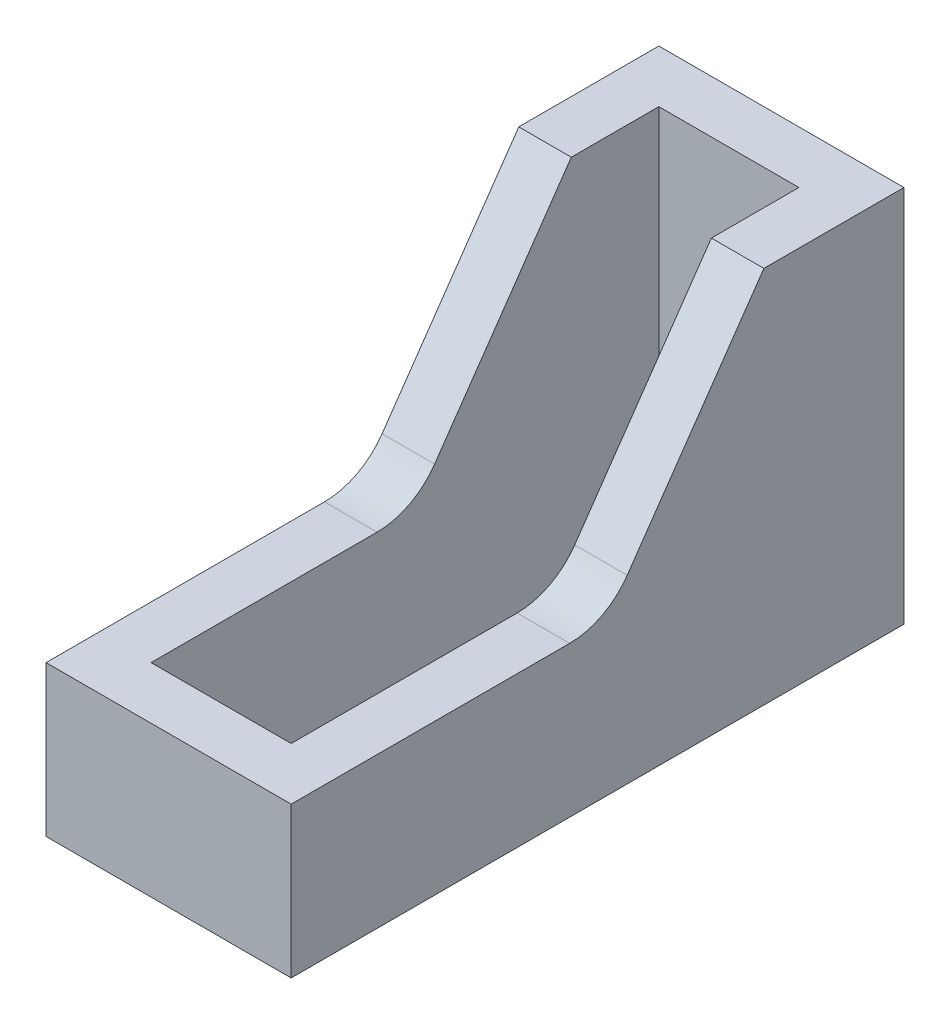
ISO-10303-21;
HEADER;
FILE_DESCRIPTION(('STEP AP214'),'2;1');
FILE_NAME('part.step','',(''),(''),'','','');
FILE_SCHEMA(('AUTOMOTIVE_DESIGN { 1 0 10303 214 1 1 1 1 }'));
ENDSEC;
DATA;
#1=APPLICATION_CONTEXT('core data for automotive mechanical design processes');
#2=APPLICATION_PROTOCOL_DEFINITION('international standard','automotive_design',2000,#1);
#3=PRODUCT_CONTEXT('',#1,'mechanical');
#4=PRODUCT('Part','Part','',(#3));
#5=PRODUCT_RELATED_PRODUCT_CATEGORY('part','',(#4));
#6=PRODUCT_DEFINITION_FORMATION('','',#4);
#7=PRODUCT_DEFINITION_CONTEXT('part definition',#1,'design');
#8=PRODUCT_DEFINITION('design','',#6,#7);
#9=PRODUCT_DEFINITION_SHAPE('','',#8);
#10=(LENGTH_UNIT() NAMED_UNIT(*) SI_UNIT(.MILLI.,.METRE.));
#11=(NAMED_UNIT(*) PLANE_ANGLE_UNIT() SI_UNIT($,.RADIAN.));
#12=(NAMED_UNIT(*) SI_UNIT($,.STERADIAN.) SOLID_ANGLE_UNIT());
#13=UNCERTAINTY_MEASURE_WITH_UNIT(LENGTH_MEASURE(1.E-05),#10,'distance_accuracy_value','');
#14=(GEOMETRIC_REPRESENTATION_CONTEXT(3) GLOBAL_UNCERTAINTY_ASSIGNED_CONTEXT((#13)) GLOBAL_UNIT_ASSIGNED_CONTEXT((#10,
#11,#12)) REPRESENTATION_CONTEXT('',''));
#15=CARTESIAN_POINT('',(0.,0.,0.));
#16=DIRECTION('',(0.,0.,1.));
#17=DIRECTION('',(1.,0.,0.));
#18=AXIS2_PLACEMENT_3D('',#15,#16,#17);
#19=CARTESIAN_POINT('',(0.,0.,17.5));
#20=DIRECTION('',(0.,0.,-1.));
#21=DIRECTION('',(-1.,0.,0.));
#22=AXIS2_PLACEMENT_3D('',#19,#20,#21);
#23=PLANE('',#22);
#24=DIRECTION('',(1.,0.,0.));
#25=VECTOR('',#24,1.);
#26=CARTESIAN_POINT('',(-28.9037865683591,4.3,17.5));
#27=LINE('',#26,#25);
#28=CARTESIAN_POINT('',(0.,4.3,17.5));
#29=VERTEX_POINT('',#28);
#30=CARTESIAN_POINT('',(7.,4.3,17.5));
#31=VERTEX_POINT('',#30);
#32=EDGE_CURVE('E167',#29,#31,#27,.T.);
#33=ORIENTED_EDGE('',*,*,#32,.F.);
#34=DIRECTION('',(0.,-1.,0.));
#35=VECTOR('',#34,1.);
#36=CARTESIAN_POINT('',(0.,0.,17.5));
#37=LINE('',#36,#35);
#38=CARTESIAN_POINT('',(0.,0.,17.5));
#39=VERTEX_POINT('',#38);
#40=EDGE_CURVE('E208',#29,#39,#37,.T.);
#41=ORIENTED_EDGE('',*,*,#40,.T.);
#42=DIRECTION('',(1.,0.,0.));
#43=VECTOR('',#42,1.);
#44=CARTESIAN_POINT('',(0.,0.,17.5));
#45=LINE('',#44,#43);
#46=CARTESIAN_POINT('',(7.,0.,17.5));
#47=VERTEX_POINT('',#46);
#48=EDGE_CURVE('E210',#39,#47,#45,.T.);
#49=ORIENTED_EDGE('',*,*,#48,.T.);
#50=DIRECTION('',(0.,1.,0.));
#51=VECTOR('',#50,1.);
#52=CARTESIAN_POINT('',(7.,0.,17.5));
#53=LINE('',#52,#51);
#54=EDGE_CURVE('E213',#47,#31,#53,.T.);
#55=ORIENTED_EDGE('',*,*,#54,.T.);
#56=EDGE_LOOP('',(#33,#41,#49,#55));
#57=FACE_BOUND('',#56,.T.);
#58=ADVANCED_FACE('F33',(#57),#23,.F.);
#59=CARTESIAN_POINT('',(0.,0.,17.5));
#60=DIRECTION('',(1.,0.,0.));
#61=DIRECTION('',(0.,0.,-1.));
#62=AXIS2_PLACEMENT_3D('',#59,#60,#61);
#63=PLANE('',#62);
#64=CARTESIAN_POINT('',(0.,6.3,9.54790589243722));
#65=DIRECTION('',(1.,0.,0.));
#66=DIRECTION('',(0.,0.,-1.));
#67=AXIS2_PLACEMENT_3D('',#64,#65,#66);
#68=CIRCLE('',#67,2.);
#69=CARTESIAN_POINT('',(0.,4.3,9.54790589243722));
#70=VERTEX_POINT('',#69);
#71=CARTESIAN_POINT('',(0.,5.16158004233939,7.90352150914965));
#72=VERTEX_POINT('',#71);
#73=EDGE_CURVE('E185',#70,#72,#68,.T.);
#74=ORIENTED_EDGE('',*,*,#73,.T.);
#75=DIRECTION('',(0.,0.822192191643779,-0.569209978830308));
#76=VECTOR('',#75,1.);
#77=CARTESIAN_POINT('',(0.,-2.8188,13.4284));
#78=LINE('',#77,#76);
#79=CARTESIAN_POINT('',(0.,10.8,4.));
#80=VERTEX_POINT('',#79);
#81=EDGE_CURVE('E190',#72,#80,#78,.T.);
#82=ORIENTED_EDGE('',*,*,#81,.T.);
#83=DIRECTION('',(0.,0.,-1.));
#84=VECTOR('',#83,1.);
#85=CARTESIAN_POINT('',(0.,10.8,17.5));
#86=LINE('',#85,#84);
#87=CARTESIAN_POINT('',(0.,10.8,0.));
#88=VERTEX_POINT('',#87);
#89=EDGE_CURVE('E216',#80,#88,#86,.T.);
#90=ORIENTED_EDGE('',*,*,#89,.T.);
#91=DIRECTION('',(0.,-1.,0.));
#92=VECTOR('',#91,1.);
#93=CARTESIAN_POINT('',(0.,0.,0.));
#94=LINE('',#93,#92);
#95=CARTESIAN_POINT('',(0.,0.,0.));
#96=VERTEX_POINT('',#95);
#97=EDGE_CURVE('E207',#88,#96,#94,.T.);
#98=ORIENTED_EDGE('',*,*,#97,.T.);
#99=DIRECTION('',(0.,0.,-1.));
#100=VECTOR('',#99,1.);
#101=CARTESIAN_POINT('',(0.,0.,17.5));
#102=LINE('',#101,#100);
#103=EDGE_CURVE('E232',#39,#96,#102,.T.);
#104=ORIENTED_EDGE('',*,*,#103,.F.);
#105=ORIENTED_EDGE('',*,*,#40,.F.);
#106=DIRECTION('',(0.,0.,-1.));
#107=VECTOR('',#106,1.);
#108=CARTESIAN_POINT('',(0.,4.3,17.5));
#109=LINE('',#108,#107);
#110=EDGE_CURVE('E179',#29,#70,#109,.T.);
#111=ORIENTED_EDGE('',*,*,#110,.T.);
#112=EDGE_LOOP('',(#74,#82,#90,#98,#104,#105,#111));
#113=FACE_BOUND('',#112,.T.);
#114=ADVANCED_FACE('F35',(#113),#63,.F.);
#115=CARTESIAN_POINT('',(0.,0.,17.5));
#116=DIRECTION('',(0.,1.,0.));
#117=DIRECTION('',(0.,0.,1.));
#118=AXIS2_PLACEMENT_3D('',#115,#116,#117);
#119=PLANE('',#118);
#120=DIRECTION('',(0.,0.,-1.));
#121=VECTOR('',#120,1.);
#122=CARTESIAN_POINT('',(5.50000000000001,0.,17.5));
#123=LINE('',#122,#121);
#124=CARTESIAN_POINT('',(5.50000000000001,0.,16.));
#125=VERTEX_POINT('',#124);
#126=CARTESIAN_POINT('',(5.50000000000001,0.,1.5));
#127=VERTEX_POINT('',#126);
#128=EDGE_CURVE('E165',#125,#127,#123,.T.);
#129=ORIENTED_EDGE('',*,*,#128,.T.);
#130=DIRECTION('',(-1.,0.,0.));
#131=VECTOR('',#130,1.);
#132=CARTESIAN_POINT('',(0.,0.,1.5));
#133=LINE('',#132,#131);
#134=CARTESIAN_POINT('',(1.5,0.,1.5));
#135=VERTEX_POINT('',#134);
#136=EDGE_CURVE('E148',#127,#135,#133,.T.);
#137=ORIENTED_EDGE('',*,*,#136,.T.);
#138=DIRECTION('',(0.,0.,1.));
#139=VECTOR('',#138,1.);
#140=CARTESIAN_POINT('',(1.5,0.,17.5));
#141=LINE('',#140,#139);
#142=CARTESIAN_POINT('',(1.5,0.,16.));
#143=VERTEX_POINT('',#142);
#144=EDGE_CURVE('E202',#135,#143,#141,.T.);
#145=ORIENTED_EDGE('',*,*,#144,.T.);
#146=DIRECTION('',(1.,0.,0.));
#147=VECTOR('',#146,1.);
#148=CARTESIAN_POINT('',(0.,0.,16.));
#149=LINE('',#148,#147);
#150=EDGE_CURVE('E205',#143,#125,#149,.T.);
#151=ORIENTED_EDGE('',*,*,#150,.T.);
#152=EDGE_LOOP('',(#129,#137,#145,#151));
#153=FACE_BOUND('',#152,.T.);
#154=DIRECTION('',(1.,0.,0.));
#155=VECTOR('',#154,1.);
#156=CARTESIAN_POINT('',(0.,0.,0.));
#157=LINE('',#156,#155);
#158=CARTESIAN_POINT('',(7.,0.,0.));
#159=VERTEX_POINT('',#158);
#160=EDGE_CURVE('E219',#96,#159,#157,.T.);
#161=ORIENTED_EDGE('',*,*,#160,.T.);
#162=DIRECTION('',(0.,0.,-1.));
#163=VECTOR('',#162,1.);
#164=CARTESIAN_POINT('',(7.,0.,17.5));
#165=LINE('',#164,#163);
#166=EDGE_CURVE('E229',#47,#159,#165,.T.);
#167=ORIENTED_EDGE('',*,*,#166,.F.);
#168=ORIENTED_EDGE('',*,*,#48,.F.);
#169=ORIENTED_EDGE('',*,*,#103,.T.);
#170=EDGE_LOOP('',(#161,#167,#168,#169));
#171=FACE_BOUND('',#170,.T.);
#172=ADVANCED_FACE('F263',(#153,#171),#119,.F.);
#173=CARTESIAN_POINT('',(7.,0.,17.5));
#174=DIRECTION('',(-1.,0.,0.));
#175=DIRECTION('',(0.,0.,1.));
#176=AXIS2_PLACEMENT_3D('',#173,#174,#175);
#177=PLANE('',#176);
#178=DIRECTION('',(0.,0.,-1.));
#179=VECTOR('',#178,1.);
#180=CARTESIAN_POINT('',(7.,10.8,17.5));
#181=LINE('',#180,#179);
#182=CARTESIAN_POINT('',(7.,10.8,4.));
#183=VERTEX_POINT('',#182);
#184=CARTESIAN_POINT('',(7.,10.8,0.));
#185=VERTEX_POINT('',#184);
#186=EDGE_CURVE('E227',#183,#185,#181,.T.);
#187=ORIENTED_EDGE('',*,*,#186,.F.);
#188=DIRECTION('',(0.,-0.822192191643779,0.569209978830308));
#189=VECTOR('',#188,1.);
#190=CARTESIAN_POINT('',(7.,-2.8188,13.4284));
#191=LINE('',#190,#189);
#192=CARTESIAN_POINT('',(7.,5.16158004233939,7.90352150914965));
#193=VERTEX_POINT('',#192);
#194=EDGE_CURVE('E142',#183,#193,#191,.T.);
#195=ORIENTED_EDGE('',*,*,#194,.T.);
#196=CARTESIAN_POINT('',(7.,6.3,9.54790589243722));
#197=DIRECTION('',(-1.,0.,0.));
#198=DIRECTION('',(0.,0.,1.));
#199=AXIS2_PLACEMENT_3D('',#196,#197,#198);
#200=CIRCLE('',#199,2.);
#201=CARTESIAN_POINT('',(7.,4.3,9.54790589243722));
#202=VERTEX_POINT('',#201);
#203=EDGE_CURVE('E182',#193,#202,#200,.T.);
#204=ORIENTED_EDGE('',*,*,#203,.T.);
#205=DIRECTION('',(0.,0.,1.));
#206=VECTOR('',#205,1.);
#207=CARTESIAN_POINT('',(7.,4.3,17.5));
#208=LINE('',#207,#206);
#209=EDGE_CURVE('E176',#202,#31,#208,.T.);
#210=ORIENTED_EDGE('',*,*,#209,.T.);
#211=ORIENTED_EDGE('',*,*,#54,.F.);
#212=ORIENTED_EDGE('',*,*,#166,.T.);
#213=DIRECTION('',(0.,1.,0.));
#214=VECTOR('',#213,1.);
#215=CARTESIAN_POINT('',(7.,0.,0.));
#216=LINE('',#215,#214);
#217=EDGE_CURVE('E221',#159,#185,#216,.T.);
#218=ORIENTED_EDGE('',*,*,#217,.T.);
#219=EDGE_LOOP('',(#187,#195,#204,#210,#211,#212,#218));
#220=FACE_BOUND('',#219,.T.);
#221=ADVANCED_FACE('F268',(#220),#177,.F.);
#222=CARTESIAN_POINT('',(0.,10.8,17.5));
#223=DIRECTION('',(0.,-1.,0.));
#224=DIRECTION('',(0.,0.,-1.));
#225=AXIS2_PLACEMENT_3D('',#222,#223,#224);
#226=PLANE('',#225);
#227=DIRECTION('',(-1.,0.,0.));
#228=VECTOR('',#227,1.);
#229=CARTESIAN_POINT('',(5.00000000000001,10.8,1.5));
#230=LINE('',#229,#228);
#231=CARTESIAN_POINT('',(5.50000000000001,10.8,1.5));
#232=VERTEX_POINT('',#231);
#233=CARTESIAN_POINT('',(1.5,10.8,1.5));
#234=VERTEX_POINT('',#233);
#235=EDGE_CURVE('E133',#232,#234,#230,.T.);
#236=ORIENTED_EDGE('',*,*,#235,.F.);
#237=DIRECTION('',(0.,0.,-1.));
#238=VECTOR('',#237,1.);
#239=CARTESIAN_POINT('',(5.50000000000001,10.8,1.5));
#240=LINE('',#239,#238);
#241=CARTESIAN_POINT('',(5.50000000000001,10.8,4.));
#242=VERTEX_POINT('',#241);
#243=EDGE_CURVE('E137',#242,#232,#240,.T.);
#244=ORIENTED_EDGE('',*,*,#243,.F.);
#245=DIRECTION('',(1.,0.,0.));
#246=VECTOR('',#245,1.);
#247=CARTESIAN_POINT('',(0.,10.8,4.));
#248=LINE('',#247,#246);
#249=EDGE_CURVE('E191',#242,#183,#248,.T.);
#250=ORIENTED_EDGE('',*,*,#249,.T.);
#251=ORIENTED_EDGE('',*,*,#186,.T.);
#252=DIRECTION('',(-1.,0.,0.));
#253=VECTOR('',#252,1.);
#254=CARTESIAN_POINT('',(0.,10.8,0.));
#255=LINE('',#254,#253);
#256=EDGE_CURVE('E211',#185,#88,#255,.T.);
#257=ORIENTED_EDGE('',*,*,#256,.T.);
#258=ORIENTED_EDGE('',*,*,#89,.F.);
#259=CARTESIAN_POINT('',(1.5,10.8,4.));
#260=VERTEX_POINT('',#259);
#261=EDGE_CURVE('E188',#80,#260,#248,.T.);
#262=ORIENTED_EDGE('',*,*,#261,.T.);
#263=DIRECTION('',(0.,0.,1.));
#264=VECTOR('',#263,1.);
#265=CARTESIAN_POINT('',(1.5,10.8,16.));
#266=LINE('',#265,#264);
#267=EDGE_CURVE('E141',#234,#260,#266,.T.);
#268=ORIENTED_EDGE('',*,*,#267,.F.);
#269=EDGE_LOOP('',(#236,#244,#250,#251,#257,#258,#262,#268));
#270=FACE_BOUND('',#269,.T.);
#271=ADVANCED_FACE('F135',(#270),#226,.F.);
#272=CARTESIAN_POINT('',(0.,0.,0.));
#273=DIRECTION('',(0.,0.,-1.));
#274=DIRECTION('',(-1.,0.,0.));
#275=AXIS2_PLACEMENT_3D('',#272,#273,#274);
#276=PLANE('',#275);
#277=ORIENTED_EDGE('',*,*,#97,.F.);
#278=ORIENTED_EDGE('',*,*,#256,.F.);
#279=ORIENTED_EDGE('',*,*,#217,.F.);
#280=ORIENTED_EDGE('',*,*,#160,.F.);
#281=EDGE_LOOP('',(#277,#278,#279,#280));
#282=FACE_BOUND('',#281,.T.);
#283=ADVANCED_FACE('F278',(#282),#276,.T.);
#284=CARTESIAN_POINT('',(5.00000000000001,-6.7,16.));
#285=DIRECTION('',(0.,0.,1.));
#286=DIRECTION('',(1.,0.,0.));
#287=AXIS2_PLACEMENT_3D('',#284,#285,#286);
#288=PLANE('',#287);
#289=DIRECTION('',(0.,1.,0.));
#290=VECTOR('',#289,1.);
#291=CARTESIAN_POINT('',(1.5,-6.7,16.));
#292=LINE('',#291,#290);
#293=CARTESIAN_POINT('',(1.5,4.3,16.));
#294=VERTEX_POINT('',#293);
#295=EDGE_CURVE('E197',#143,#294,#292,.T.);
#296=ORIENTED_EDGE('',*,*,#295,.T.);
#297=DIRECTION('',(1.,0.,0.));
#298=VECTOR('',#297,1.);
#299=CARTESIAN_POINT('',(5.00000000000001,4.3,16.));
#300=LINE('',#299,#298);
#301=CARTESIAN_POINT('',(5.50000000000001,4.3,16.));
#302=VERTEX_POINT('',#301);
#303=EDGE_CURVE('E47',#294,#302,#300,.T.);
#304=ORIENTED_EDGE('',*,*,#303,.T.);
#305=DIRECTION('',(0.,1.,0.));
#306=VECTOR('',#305,1.);
#307=CARTESIAN_POINT('',(5.50000000000001,-6.7,16.));
#308=LINE('',#307,#306);
#309=EDGE_CURVE('E153',#125,#302,#308,.T.);
#310=ORIENTED_EDGE('',*,*,#309,.F.);
#311=ORIENTED_EDGE('',*,*,#150,.F.);
#312=EDGE_LOOP('',(#296,#304,#310,#311));
#313=FACE_BOUND('',#312,.T.);
#314=ADVANCED_FACE('F280',(#313),#288,.F.);
#315=CARTESIAN_POINT('',(1.5,-6.7,16.));
#316=DIRECTION('',(-1.,0.,0.));
#317=DIRECTION('',(0.,0.,1.));
#318=AXIS2_PLACEMENT_3D('',#315,#316,#317);
#319=PLANE('',#318);
#320=ORIENTED_EDGE('',*,*,#267,.T.);
#321=DIRECTION('',(0.,-0.822192191643779,0.569209978830308));
#322=VECTOR('',#321,1.);
#323=CARTESIAN_POINT('',(1.5,-6.646,16.078));
#324=LINE('',#323,#322);
#325=CARTESIAN_POINT('',(1.5,5.16158004233939,7.90352150914965));
#326=VERTEX_POINT('',#325);
#327=EDGE_CURVE('E41',#260,#326,#324,.T.);
#328=ORIENTED_EDGE('',*,*,#327,.T.);
#329=CARTESIAN_POINT('',(1.5,6.3,9.54790589243722));
#330=DIRECTION('',(-1.,0.,0.));
#331=DIRECTION('',(0.,0.,1.));
#332=AXIS2_PLACEMENT_3D('',#329,#330,#331);
#333=CIRCLE('',#332,2.);
#334=CARTESIAN_POINT('',(1.5,4.3,9.54790589243722));
#335=VERTEX_POINT('',#334);
#336=EDGE_CURVE('E237',#326,#335,#333,.T.);
#337=ORIENTED_EDGE('',*,*,#336,.T.);
#338=DIRECTION('',(0.,0.,1.));
#339=VECTOR('',#338,1.);
#340=CARTESIAN_POINT('',(1.5,4.3,16.));
#341=LINE('',#340,#339);
#342=EDGE_CURVE('E235',#335,#294,#341,.T.);
#343=ORIENTED_EDGE('',*,*,#342,.T.);
#344=ORIENTED_EDGE('',*,*,#295,.F.);
#345=ORIENTED_EDGE('',*,*,#144,.F.);
#346=DIRECTION('',(0.,1.,0.));
#347=VECTOR('',#346,1.);
#348=CARTESIAN_POINT('',(1.5,-6.7,1.5));
#349=LINE('',#348,#347);
#350=EDGE_CURVE('E55',#135,#234,#349,.T.);
#351=ORIENTED_EDGE('',*,*,#350,.T.);
#352=EDGE_LOOP('',(#320,#328,#337,#343,#344,#345,#351));
#353=FACE_BOUND('',#352,.T.);
#354=ADVANCED_FACE('F241',(#353),#319,.F.);
#355=CARTESIAN_POINT('',(5.00000000000001,-6.7,1.5));
#356=DIRECTION('',(0.,0.,-1.));
#357=DIRECTION('',(-1.,0.,0.));
#358=AXIS2_PLACEMENT_3D('',#355,#356,#357);
#359=PLANE('',#358);
#360=ORIENTED_EDGE('',*,*,#136,.F.);
#361=DIRECTION('',(0.,1.,0.));
#362=VECTOR('',#361,1.);
#363=CARTESIAN_POINT('',(5.50000000000001,-6.7,1.5));
#364=LINE('',#363,#362);
#365=EDGE_CURVE('E145',#127,#232,#364,.T.);
#366=ORIENTED_EDGE('',*,*,#365,.T.);
#367=ORIENTED_EDGE('',*,*,#235,.T.);
#368=ORIENTED_EDGE('',*,*,#350,.F.);
#369=EDGE_LOOP('',(#360,#366,#367,#368));
#370=FACE_BOUND('',#369,.T.);
#371=ADVANCED_FACE('F146',(#370),#359,.F.);
#372=CARTESIAN_POINT('',(-28.9037865683591,5.16158004233939,7.90352150914965));
#373=DIRECTION('',(0.,-0.569209978830308,-0.822192191643779));
#374=DIRECTION('',(0.,0.822192191643779,-0.569209978830308));
#375=AXIS2_PLACEMENT_3D('',#372,#373,#374);
#376=PLANE('',#375);
#377=ORIENTED_EDGE('',*,*,#249,.F.);
#378=DIRECTION('',(0.,-0.822192191643779,0.569209978830308));
#379=VECTOR('',#378,1.);
#380=CARTESIAN_POINT('',(5.50000000000001,5.16158004233939,7.90352150914965));
#381=LINE('',#380,#379);
#382=CARTESIAN_POINT('',(5.50000000000001,5.16158004233939,7.90352150914965));
#383=VERTEX_POINT('',#382);
#384=EDGE_CURVE('E158',#242,#383,#381,.T.);
#385=ORIENTED_EDGE('',*,*,#384,.T.);
#386=DIRECTION('',(1.,0.,0.));
#387=VECTOR('',#386,1.);
#388=CARTESIAN_POINT('',(-28.9037865683591,5.16158004233939,7.90352150914965));
#389=LINE('',#388,#387);
#390=EDGE_CURVE('E172',#383,#193,#389,.T.);
#391=ORIENTED_EDGE('',*,*,#390,.T.);
#392=ORIENTED_EDGE('',*,*,#194,.F.);
#393=EDGE_LOOP('',(#377,#385,#391,#392));
#394=FACE_BOUND('',#393,.T.);
#395=ADVANCED_FACE('F275',(#394),#376,.F.);
#396=ORIENTED_EDGE('',*,*,#81,.F.);
#397=EDGE_CURVE('E174',#72,#326,#389,.T.);
#398=ORIENTED_EDGE('',*,*,#397,.T.);
#399=ORIENTED_EDGE('',*,*,#327,.F.);
#400=ORIENTED_EDGE('',*,*,#261,.F.);
#401=EDGE_LOOP('',(#396,#398,#399,#400));
#402=FACE_BOUND('',#401,.T.);
#403=ADVANCED_FACE('F244',(#402),#376,.F.);
#404=CARTESIAN_POINT('',(-28.9037865683591,6.3,9.54790589243722));
#405=DIRECTION('',(1.,0.,0.));
#406=DIRECTION('',(0.,0.,-1.));
#407=AXIS2_PLACEMENT_3D('',#404,#405,#406);
#408=CYLINDRICAL_SURFACE('',#407,2.);
#409=ORIENTED_EDGE('',*,*,#73,.F.);
#410=DIRECTION('',(1.,0.,0.));
#411=VECTOR('',#410,1.);
#412=CARTESIAN_POINT('',(-28.9037865683591,4.3,9.54790589243722));
#413=LINE('',#412,#411);
#414=EDGE_CURVE('E171',#70,#335,#413,.T.);
#415=ORIENTED_EDGE('',*,*,#414,.T.);
#416=ORIENTED_EDGE('',*,*,#336,.F.);
#417=ORIENTED_EDGE('',*,*,#397,.F.);
#418=EDGE_LOOP('',(#409,#415,#416,#417));
#419=FACE_BOUND('',#418,.T.);
#420=ADVANCED_FACE('F252',(#419),#408,.F.);
#421=ORIENTED_EDGE('',*,*,#390,.F.);
#422=CARTESIAN_POINT('',(5.50000000000001,6.3,9.54790589243722));
#423=DIRECTION('',(1.,0.,0.));
#424=DIRECTION('',(0.,0.,-1.));
#425=AXIS2_PLACEMENT_3D('',#422,#423,#424);
#426=CIRCLE('',#425,2.);
#427=CARTESIAN_POINT('',(5.50000000000001,4.3,9.54790589243722));
#428=VERTEX_POINT('',#427);
#429=EDGE_CURVE('E152',#383,#428,#426,.F.);
#430=ORIENTED_EDGE('',*,*,#429,.T.);
#431=EDGE_CURVE('E169',#428,#202,#413,.T.);
#432=ORIENTED_EDGE('',*,*,#431,.T.);
#433=ORIENTED_EDGE('',*,*,#203,.F.);
#434=EDGE_LOOP('',(#421,#430,#432,#433));
#435=FACE_BOUND('',#434,.T.);
#436=ADVANCED_FACE('F273',(#435),#408,.F.);
#437=CARTESIAN_POINT('',(-28.9037865683591,4.3,17.5));
#438=DIRECTION('',(0.,-1.,0.));
#439=DIRECTION('',(0.,0.,-1.));
#440=AXIS2_PLACEMENT_3D('',#437,#438,#439);
#441=PLANE('',#440);
#442=ORIENTED_EDGE('',*,*,#431,.F.);
#443=DIRECTION('',(0.,0.,1.));
#444=VECTOR('',#443,1.);
#445=CARTESIAN_POINT('',(5.50000000000001,4.3,17.5));
#446=LINE('',#445,#444);
#447=EDGE_CURVE('E11',#428,#302,#446,.T.);
#448=ORIENTED_EDGE('',*,*,#447,.T.);
#449=ORIENTED_EDGE('',*,*,#303,.F.);
#450=ORIENTED_EDGE('',*,*,#342,.F.);
#451=ORIENTED_EDGE('',*,*,#414,.F.);
#452=ORIENTED_EDGE('',*,*,#110,.F.);
#453=ORIENTED_EDGE('',*,*,#32,.T.);
#454=ORIENTED_EDGE('',*,*,#209,.F.);
#455=EDGE_LOOP('',(#442,#448,#449,#450,#451,#452,#453,#454));
#456=FACE_BOUND('',#455,.T.);
#457=ADVANCED_FACE('F256',(#456),#441,.F.);
#458=CARTESIAN_POINT('',(5.50000000000001,-6.7,1.5));
#459=DIRECTION('',(1.,0.,0.));
#460=DIRECTION('',(0.,0.,-1.));
#461=AXIS2_PLACEMENT_3D('',#458,#459,#460);
#462=PLANE('',#461);
#463=ORIENTED_EDGE('',*,*,#309,.T.);
#464=ORIENTED_EDGE('',*,*,#447,.F.);
#465=ORIENTED_EDGE('',*,*,#429,.F.);
#466=ORIENTED_EDGE('',*,*,#384,.F.);
#467=ORIENTED_EDGE('',*,*,#243,.T.);
#468=ORIENTED_EDGE('',*,*,#365,.F.);
#469=ORIENTED_EDGE('',*,*,#128,.F.);
#470=EDGE_LOOP('',(#463,#464,#465,#466,#467,#468,#469));
#471=FACE_BOUND('',#470,.T.);
#472=ADVANCED_FACE('F156',(#471),#462,.F.);
#473=CLOSED_SHELL('',(#58,#114,#172,#221,#271,#283,#314,#354,#371,#395,#403,#420,#436,#457,#472));
#474=MANIFOLD_SOLID_BREP('B2',#473);
#475=ADVANCED_BREP_SHAPE_REPRESENTATION('',(#18,#474),#14);
#476=SHAPE_DEFINITION_REPRESENTATION(#9,#475);
ENDSEC;
END-ISO-10303-21;
